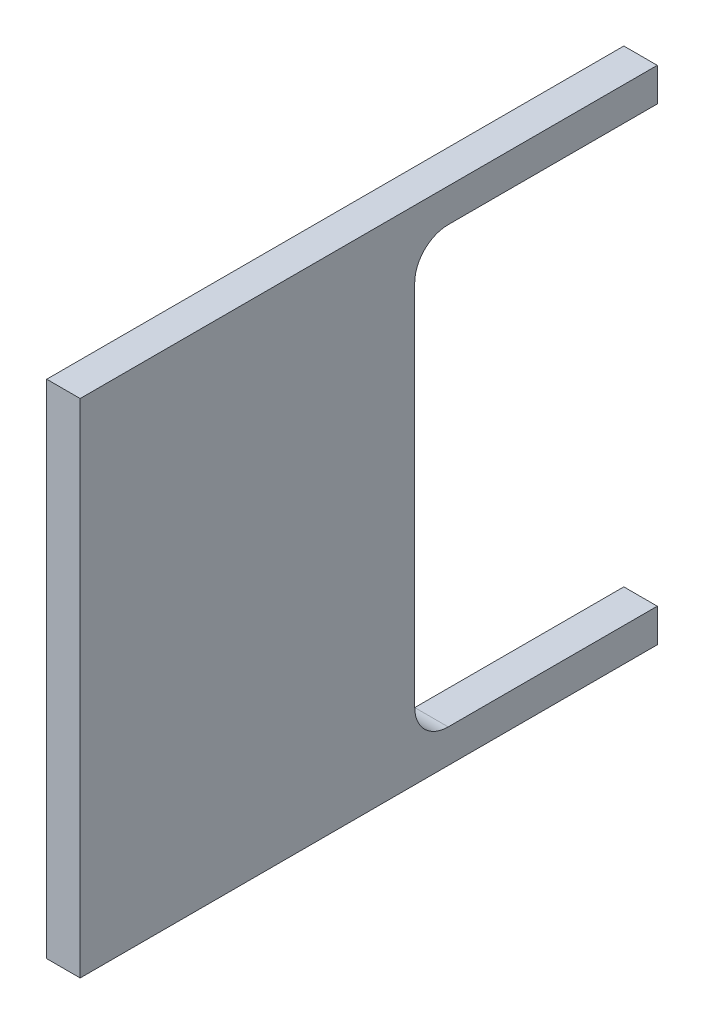
ISO-10303-21;
HEADER;
FILE_DESCRIPTION(('STEP AP214'),'2;1');
FILE_NAME('part.step','',(''),(''),'','','');
FILE_SCHEMA(('AUTOMOTIVE_DESIGN { 1 0 10303 214 1 1 1 1 }'));
ENDSEC;
DATA;
#1=APPLICATION_CONTEXT('core data for automotive mechanical design processes');
#2=APPLICATION_PROTOCOL_DEFINITION('international standard','automotive_design',2000,#1);
#3=PRODUCT_CONTEXT('',#1,'mechanical');
#4=PRODUCT('Part','Part','',(#3));
#5=PRODUCT_RELATED_PRODUCT_CATEGORY('part','',(#4));
#6=PRODUCT_DEFINITION_FORMATION('','',#4);
#7=PRODUCT_DEFINITION_CONTEXT('part definition',#1,'design');
#8=PRODUCT_DEFINITION('design','',#6,#7);
#9=PRODUCT_DEFINITION_SHAPE('','',#8);
#10=(LENGTH_UNIT() NAMED_UNIT(*) SI_UNIT(.MILLI.,.METRE.));
#11=(NAMED_UNIT(*) PLANE_ANGLE_UNIT() SI_UNIT($,.RADIAN.));
#12=(NAMED_UNIT(*) SI_UNIT($,.STERADIAN.) SOLID_ANGLE_UNIT());
#13=UNCERTAINTY_MEASURE_WITH_UNIT(LENGTH_MEASURE(1.E-05),#10,'distance_accuracy_value','');
#14=(GEOMETRIC_REPRESENTATION_CONTEXT(3) GLOBAL_UNCERTAINTY_ASSIGNED_CONTEXT((#13)) GLOBAL_UNIT_ASSIGNED_CONTEXT((#10,
#11,#12)) REPRESENTATION_CONTEXT('',''));
#15=CARTESIAN_POINT('',(0.,0.,0.));
#16=DIRECTION('',(0.,0.,1.));
#17=DIRECTION('',(1.,0.,0.));
#18=AXIS2_PLACEMENT_3D('',#15,#16,#17);
#19=CARTESIAN_POINT('',(12.7,-95.25,-109.5375));
#20=DIRECTION('',(0.,0.,1.));
#21=DIRECTION('',(1.,0.,0.));
#22=AXIS2_PLACEMENT_3D('',#19,#20,#21);
#23=PLANE('',#22);
#24=DIRECTION('',(0.,1.,0.));
#25=VECTOR('',#24,1.);
#26=CARTESIAN_POINT('',(0.,-95.25,-109.5375));
#27=LINE('',#26,#25);
#28=CARTESIAN_POINT('',(0.,-95.25,-109.5375));
#29=VERTEX_POINT('',#28);
#30=CARTESIAN_POINT('',(0.,-82.55,-109.5375));
#31=VERTEX_POINT('',#30);
#32=EDGE_CURVE('E113',#29,#31,#27,.T.);
#33=ORIENTED_EDGE('',*,*,#32,.T.);
#34=DIRECTION('',(1.,0.,0.));
#35=VECTOR('',#34,1.);
#36=CARTESIAN_POINT('',(-0.000999999999999265,-82.55,-109.5375));
#37=LINE('',#36,#35);
#38=CARTESIAN_POINT('',(12.7,-82.55,-109.5375));
#39=VERTEX_POINT('',#38);
#40=EDGE_CURVE('E123',#31,#39,#37,.T.);
#41=ORIENTED_EDGE('',*,*,#40,.T.);
#42=DIRECTION('',(0.,1.,0.));
#43=VECTOR('',#42,1.);
#44=CARTESIAN_POINT('',(12.7,-95.25,-109.5375));
#45=LINE('',#44,#43);
#46=CARTESIAN_POINT('',(12.7,-95.25,-109.5375));
#47=VERTEX_POINT('',#46);
#48=EDGE_CURVE('E300',#47,#39,#45,.T.);
#49=ORIENTED_EDGE('',*,*,#48,.F.);
#50=DIRECTION('',(-1.,0.,0.));
#51=VECTOR('',#50,1.);
#52=CARTESIAN_POINT('',(12.7,-95.25,-109.5375));
#53=LINE('',#52,#51);
#54=EDGE_CURVE('E135',#47,#29,#53,.T.);
#55=ORIENTED_EDGE('',*,*,#54,.T.);
#56=EDGE_LOOP('',(#33,#41,#49,#55));
#57=FACE_BOUND('',#56,.T.);
#58=ADVANCED_FACE('F31',(#57),#23,.F.);
#59=CARTESIAN_POINT('',(12.7,82.55,-109.5375));
#60=VERTEX_POINT('',#59);
#61=CARTESIAN_POINT('',(12.7,95.25,-109.5375));
#62=VERTEX_POINT('',#61);
#63=EDGE_CURVE('E148',#60,#62,#45,.T.);
#64=ORIENTED_EDGE('',*,*,#63,.F.);
#65=DIRECTION('',(1.,0.,0.));
#66=VECTOR('',#65,1.);
#67=CARTESIAN_POINT('',(-0.000999999999999265,82.55,-109.5375));
#68=LINE('',#67,#66);
#69=CARTESIAN_POINT('',(0.,82.55,-109.5375));
#70=VERTEX_POINT('',#69);
#71=EDGE_CURVE('E131',#70,#60,#68,.T.);
#72=ORIENTED_EDGE('',*,*,#71,.F.);
#73=CARTESIAN_POINT('',(0.,95.25,-109.5375));
#74=VERTEX_POINT('',#73);
#75=EDGE_CURVE('E137',#70,#74,#27,.T.);
#76=ORIENTED_EDGE('',*,*,#75,.T.);
#77=DIRECTION('',(-1.,0.,0.));
#78=VECTOR('',#77,1.);
#79=CARTESIAN_POINT('',(12.7,95.25,-109.5375));
#80=LINE('',#79,#78);
#81=EDGE_CURVE('E156',#62,#74,#80,.T.);
#82=ORIENTED_EDGE('',*,*,#81,.F.);
#83=EDGE_LOOP('',(#64,#72,#76,#82));
#84=FACE_BOUND('',#83,.T.);
#85=ADVANCED_FACE('F190',(#84),#23,.F.);
#86=CARTESIAN_POINT('',(12.7,95.25,109.5375));
#87=DIRECTION('',(0.,-1.,0.));
#88=DIRECTION('',(0.,0.,-1.));
#89=AXIS2_PLACEMENT_3D('',#86,#87,#88);
#90=PLANE('',#89);
#91=DIRECTION('',(0.,0.,1.));
#92=VECTOR('',#91,1.);
#93=CARTESIAN_POINT('',(0.,95.25,109.5375));
#94=LINE('',#93,#92);
#95=CARTESIAN_POINT('',(0.,95.25,109.5375));
#96=VERTEX_POINT('',#95);
#97=EDGE_CURVE('E136',#74,#96,#94,.T.);
#98=ORIENTED_EDGE('',*,*,#97,.T.);
#99=DIRECTION('',(-1.,0.,0.));
#100=VECTOR('',#99,1.);
#101=CARTESIAN_POINT('',(12.7,95.25,109.5375));
#102=LINE('',#101,#100);
#103=CARTESIAN_POINT('',(12.7,95.25,109.5375));
#104=VERTEX_POINT('',#103);
#105=EDGE_CURVE('E153',#104,#96,#102,.T.);
#106=ORIENTED_EDGE('',*,*,#105,.F.);
#107=DIRECTION('',(0.,0.,1.));
#108=VECTOR('',#107,1.);
#109=CARTESIAN_POINT('',(12.7,95.25,109.5375));
#110=LINE('',#109,#108);
#111=EDGE_CURVE('E292',#62,#104,#110,.T.);
#112=ORIENTED_EDGE('',*,*,#111,.F.);
#113=ORIENTED_EDGE('',*,*,#81,.T.);
#114=EDGE_LOOP('',(#98,#106,#112,#113));
#115=FACE_BOUND('',#114,.T.);
#116=ADVANCED_FACE('F194',(#115),#90,.F.);
#117=CARTESIAN_POINT('',(12.7,-95.25,109.5375));
#118=DIRECTION('',(0.,0.,-1.));
#119=DIRECTION('',(-1.,0.,0.));
#120=AXIS2_PLACEMENT_3D('',#117,#118,#119);
#121=PLANE('',#120);
#122=DIRECTION('',(0.,-1.,0.));
#123=VECTOR('',#122,1.);
#124=CARTESIAN_POINT('',(0.,-95.25,109.5375));
#125=LINE('',#124,#123);
#126=CARTESIAN_POINT('',(0.,-95.25,109.5375));
#127=VERTEX_POINT('',#126);
#128=EDGE_CURVE('E139',#96,#127,#125,.T.);
#129=ORIENTED_EDGE('',*,*,#128,.T.);
#130=DIRECTION('',(-1.,0.,0.));
#131=VECTOR('',#130,1.);
#132=CARTESIAN_POINT('',(12.7,-95.25,109.5375));
#133=LINE('',#132,#131);
#134=CARTESIAN_POINT('',(12.7,-95.25,109.5375));
#135=VERTEX_POINT('',#134);
#136=EDGE_CURVE('E150',#135,#127,#133,.T.);
#137=ORIENTED_EDGE('',*,*,#136,.F.);
#138=DIRECTION('',(0.,-1.,0.));
#139=VECTOR('',#138,1.);
#140=CARTESIAN_POINT('',(12.7,-95.25,109.5375));
#141=LINE('',#140,#139);
#142=EDGE_CURVE('E290',#104,#135,#141,.T.);
#143=ORIENTED_EDGE('',*,*,#142,.F.);
#144=ORIENTED_EDGE('',*,*,#105,.T.);
#145=EDGE_LOOP('',(#129,#137,#143,#144));
#146=FACE_BOUND('',#145,.T.);
#147=ADVANCED_FACE('F199',(#146),#121,.F.);
#148=CARTESIAN_POINT('',(12.7,-95.25,109.5375));
#149=DIRECTION('',(0.,1.,0.));
#150=DIRECTION('',(0.,0.,1.));
#151=AXIS2_PLACEMENT_3D('',#148,#149,#150);
#152=PLANE('',#151);
#153=DIRECTION('',(0.,0.,-1.));
#154=VECTOR('',#153,1.);
#155=CARTESIAN_POINT('',(0.,-95.25,109.5375));
#156=LINE('',#155,#154);
#157=EDGE_CURVE('E146',#127,#29,#156,.T.);
#158=ORIENTED_EDGE('',*,*,#157,.T.);
#159=ORIENTED_EDGE('',*,*,#54,.F.);
#160=DIRECTION('',(0.,0.,-1.));
#161=VECTOR('',#160,1.);
#162=CARTESIAN_POINT('',(12.7,-95.25,109.5375));
#163=LINE('',#162,#161);
#164=EDGE_CURVE('E142',#135,#47,#163,.T.);
#165=ORIENTED_EDGE('',*,*,#164,.F.);
#166=ORIENTED_EDGE('',*,*,#136,.T.);
#167=EDGE_LOOP('',(#158,#159,#165,#166));
#168=FACE_BOUND('',#167,.T.);
#169=ADVANCED_FACE('F203',(#168),#152,.F.);
#170=CARTESIAN_POINT('',(12.7,95.25,-109.5375));
#171=DIRECTION('',(-1.,0.,0.));
#172=DIRECTION('',(0.,0.,1.));
#173=AXIS2_PLACEMENT_3D('',#170,#171,#172);
#174=PLANE('',#173);
#175=ORIENTED_EDGE('',*,*,#48,.T.);
#176=DIRECTION('',(0.,0.,-1.));
#177=VECTOR('',#176,1.);
#178=CARTESIAN_POINT('',(12.7,-82.55,-109.5375));
#179=LINE('',#178,#177);
#180=CARTESIAN_POINT('',(12.7,-82.55,-30.1625));
#181=VERTEX_POINT('',#180);
#182=EDGE_CURVE('E126',#181,#39,#179,.T.);
#183=ORIENTED_EDGE('',*,*,#182,.F.);
#184=CARTESIAN_POINT('',(12.7,-69.85,-30.1625));
#185=DIRECTION('',(-1.,0.,0.));
#186=DIRECTION('',(0.,0.,1.));
#187=AXIS2_PLACEMENT_3D('',#184,#185,#186);
#188=CIRCLE('',#187,12.7);
#189=CARTESIAN_POINT('',(12.7,-69.85,-17.4625));
#190=VERTEX_POINT('',#189);
#191=EDGE_CURVE('E167',#181,#190,#188,.T.);
#192=ORIENTED_EDGE('',*,*,#191,.T.);
#193=DIRECTION('',(0.,-1.,0.));
#194=VECTOR('',#193,1.);
#195=CARTESIAN_POINT('',(12.7,82.55,-17.4625));
#196=LINE('',#195,#194);
#197=CARTESIAN_POINT('',(12.7,69.85,-17.4625));
#198=VERTEX_POINT('',#197);
#199=EDGE_CURVE('E171',#198,#190,#196,.T.);
#200=ORIENTED_EDGE('',*,*,#199,.F.);
#201=CARTESIAN_POINT('',(12.7,69.85,-30.1625));
#202=DIRECTION('',(-1.,0.,0.));
#203=DIRECTION('',(0.,0.,1.));
#204=AXIS2_PLACEMENT_3D('',#201,#202,#203);
#205=CIRCLE('',#204,12.7);
#206=CARTESIAN_POINT('',(12.7,82.55,-30.1625));
#207=VERTEX_POINT('',#206);
#208=EDGE_CURVE('E39',#198,#207,#205,.T.);
#209=ORIENTED_EDGE('',*,*,#208,.T.);
#210=DIRECTION('',(0.,0.,1.));
#211=VECTOR('',#210,1.);
#212=CARTESIAN_POINT('',(12.7,82.55,-109.5375));
#213=LINE('',#212,#211);
#214=EDGE_CURVE('E119',#60,#207,#213,.T.);
#215=ORIENTED_EDGE('',*,*,#214,.F.);
#216=ORIENTED_EDGE('',*,*,#63,.T.);
#217=ORIENTED_EDGE('',*,*,#111,.T.);
#218=ORIENTED_EDGE('',*,*,#142,.T.);
#219=ORIENTED_EDGE('',*,*,#164,.T.);
#220=EDGE_LOOP('',(#175,#183,#192,#200,#209,#215,#216,#217,#218,#219));
#221=FACE_BOUND('',#220,.T.);
#222=ADVANCED_FACE('F170',(#221),#174,.F.);
#223=CARTESIAN_POINT('',(0.,95.25,-109.5375));
#224=DIRECTION('',(-1.,0.,0.));
#225=DIRECTION('',(0.,0.,1.));
#226=AXIS2_PLACEMENT_3D('',#223,#224,#225);
#227=PLANE('',#226);
#228=DIRECTION('',(0.,-1.,0.));
#229=VECTOR('',#228,1.);
#230=CARTESIAN_POINT('',(0.,82.55,-17.4625));
#231=LINE('',#230,#229);
#232=CARTESIAN_POINT('',(0.,69.85,-17.4625));
#233=VERTEX_POINT('',#232);
#234=CARTESIAN_POINT('',(0.,-69.85,-17.4625));
#235=VERTEX_POINT('',#234);
#236=EDGE_CURVE('E120',#233,#235,#231,.T.);
#237=ORIENTED_EDGE('',*,*,#236,.T.);
#238=CARTESIAN_POINT('',(0.,-69.85,-30.1625));
#239=DIRECTION('',(-1.,0.,0.));
#240=DIRECTION('',(0.,0.,1.));
#241=AXIS2_PLACEMENT_3D('',#238,#239,#240);
#242=CIRCLE('',#241,12.7);
#243=CARTESIAN_POINT('',(0.,-82.55,-30.1625));
#244=VERTEX_POINT('',#243);
#245=EDGE_CURVE('E115',#235,#244,#242,.F.);
#246=ORIENTED_EDGE('',*,*,#245,.T.);
#247=DIRECTION('',(0.,0.,-1.));
#248=VECTOR('',#247,1.);
#249=CARTESIAN_POINT('',(0.,-82.55,-109.5375));
#250=LINE('',#249,#248);
#251=EDGE_CURVE('E107',#244,#31,#250,.T.);
#252=ORIENTED_EDGE('',*,*,#251,.T.);
#253=ORIENTED_EDGE('',*,*,#32,.F.);
#254=ORIENTED_EDGE('',*,*,#157,.F.);
#255=ORIENTED_EDGE('',*,*,#128,.F.);
#256=ORIENTED_EDGE('',*,*,#97,.F.);
#257=ORIENTED_EDGE('',*,*,#75,.F.);
#258=DIRECTION('',(0.,0.,1.));
#259=VECTOR('',#258,1.);
#260=CARTESIAN_POINT('',(0.,82.55,-109.5375));
#261=LINE('',#260,#259);
#262=CARTESIAN_POINT('',(0.,82.55,-30.1625));
#263=VERTEX_POINT('',#262);
#264=EDGE_CURVE('E130',#70,#263,#261,.T.);
#265=ORIENTED_EDGE('',*,*,#264,.T.);
#266=CARTESIAN_POINT('',(0.,69.85,-30.1625));
#267=DIRECTION('',(-1.,0.,0.));
#268=DIRECTION('',(0.,0.,1.));
#269=AXIS2_PLACEMENT_3D('',#266,#267,#268);
#270=CIRCLE('',#269,12.7);
#271=EDGE_CURVE('E11',#263,#233,#270,.F.);
#272=ORIENTED_EDGE('',*,*,#271,.T.);
#273=EDGE_LOOP('',(#237,#246,#252,#253,#254,#255,#256,#257,#265,#272));
#274=FACE_BOUND('',#273,.T.);
#275=ADVANCED_FACE('F110',(#274),#227,.T.);
#276=CARTESIAN_POINT('',(-0.000999999999999265,-82.55,-109.5375));
#277=DIRECTION('',(0.,-1.,0.));
#278=DIRECTION('',(0.,0.,-1.));
#279=AXIS2_PLACEMENT_3D('',#276,#277,#278);
#280=PLANE('',#279);
#281=ORIENTED_EDGE('',*,*,#251,.F.);
#282=DIRECTION('',(1.,0.,0.));
#283=VECTOR('',#282,1.);
#284=CARTESIAN_POINT('',(12.7,-82.55,-30.1625));
#285=LINE('',#284,#283);
#286=EDGE_CURVE('E159',#244,#181,#285,.T.);
#287=ORIENTED_EDGE('',*,*,#286,.T.);
#288=ORIENTED_EDGE('',*,*,#182,.T.);
#289=ORIENTED_EDGE('',*,*,#40,.F.);
#290=EDGE_LOOP('',(#281,#287,#288,#289));
#291=FACE_BOUND('',#290,.T.);
#292=ADVANCED_FACE('F124',(#291),#280,.F.);
#293=CARTESIAN_POINT('',(-0.000999999999999265,82.55,-17.4625));
#294=DIRECTION('',(0.,0.,1.));
#295=DIRECTION('',(1.,0.,0.));
#296=AXIS2_PLACEMENT_3D('',#293,#294,#295);
#297=PLANE('',#296);
#298=ORIENTED_EDGE('',*,*,#199,.T.);
#299=DIRECTION('',(1.,0.,0.));
#300=VECTOR('',#299,1.);
#301=CARTESIAN_POINT('',(0.,-69.85,-17.4625));
#302=LINE('',#301,#300);
#303=EDGE_CURVE('E164',#190,#235,#302,.F.);
#304=ORIENTED_EDGE('',*,*,#303,.T.);
#305=ORIENTED_EDGE('',*,*,#236,.F.);
#306=DIRECTION('',(1.,0.,0.));
#307=VECTOR('',#306,1.);
#308=CARTESIAN_POINT('',(12.7,69.85,-17.4625));
#309=LINE('',#308,#307);
#310=EDGE_CURVE('E161',#233,#198,#309,.T.);
#311=ORIENTED_EDGE('',*,*,#310,.T.);
#312=EDGE_LOOP('',(#298,#304,#305,#311));
#313=FACE_BOUND('',#312,.T.);
#314=ADVANCED_FACE('F175',(#313),#297,.F.);
#315=CARTESIAN_POINT('',(-0.000999999999999265,82.55,-109.5375));
#316=DIRECTION('',(0.,1.,0.));
#317=DIRECTION('',(0.,0.,1.));
#318=AXIS2_PLACEMENT_3D('',#315,#316,#317);
#319=PLANE('',#318);
#320=ORIENTED_EDGE('',*,*,#214,.T.);
#321=DIRECTION('',(1.,0.,0.));
#322=VECTOR('',#321,1.);
#323=CARTESIAN_POINT('',(0.,82.55,-30.1625));
#324=LINE('',#323,#322);
#325=EDGE_CURVE('E46',#207,#263,#324,.F.);
#326=ORIENTED_EDGE('',*,*,#325,.T.);
#327=ORIENTED_EDGE('',*,*,#264,.F.);
#328=ORIENTED_EDGE('',*,*,#71,.T.);
#329=EDGE_LOOP('',(#320,#326,#327,#328));
#330=FACE_BOUND('',#329,.T.);
#331=ADVANCED_FACE('F181',(#330),#319,.F.);
#332=CARTESIAN_POINT('',(-0.000999999999999265,-69.85,-30.1625));
#333=DIRECTION('',(-1.,0.,0.));
#334=DIRECTION('',(0.,0.,1.));
#335=AXIS2_PLACEMENT_3D('',#332,#333,#334);
#336=CYLINDRICAL_SURFACE('',#335,12.7);
#337=ORIENTED_EDGE('',*,*,#245,.F.);
#338=ORIENTED_EDGE('',*,*,#303,.F.);
#339=ORIENTED_EDGE('',*,*,#191,.F.);
#340=ORIENTED_EDGE('',*,*,#286,.F.);
#341=EDGE_LOOP('',(#337,#338,#339,#340));
#342=FACE_BOUND('',#341,.T.);
#343=ADVANCED_FACE('F179',(#342),#336,.F.);
#344=CARTESIAN_POINT('',(-0.000999999999999265,69.85,-30.1625));
#345=DIRECTION('',(-1.,0.,0.));
#346=DIRECTION('',(0.,0.,1.));
#347=AXIS2_PLACEMENT_3D('',#344,#345,#346);
#348=CYLINDRICAL_SURFACE('',#347,12.7);
#349=ORIENTED_EDGE('',*,*,#271,.F.);
#350=ORIENTED_EDGE('',*,*,#325,.F.);
#351=ORIENTED_EDGE('',*,*,#208,.F.);
#352=ORIENTED_EDGE('',*,*,#310,.F.);
#353=EDGE_LOOP('',(#349,#350,#351,#352));
#354=FACE_BOUND('',#353,.T.);
#355=ADVANCED_FACE('F33',(#354),#348,.F.);
#356=CLOSED_SHELL('',(#58,#85,#116,#147,#169,#222,#275,#292,#314,#331,#343,#355));
#357=MANIFOLD_SOLID_BREP('B2',#356);
#358=ADVANCED_BREP_SHAPE_REPRESENTATION('',(#18,#357),#14);
#359=SHAPE_DEFINITION_REPRESENTATION(#9,#358);
ENDSEC;
END-ISO-10303-21;
